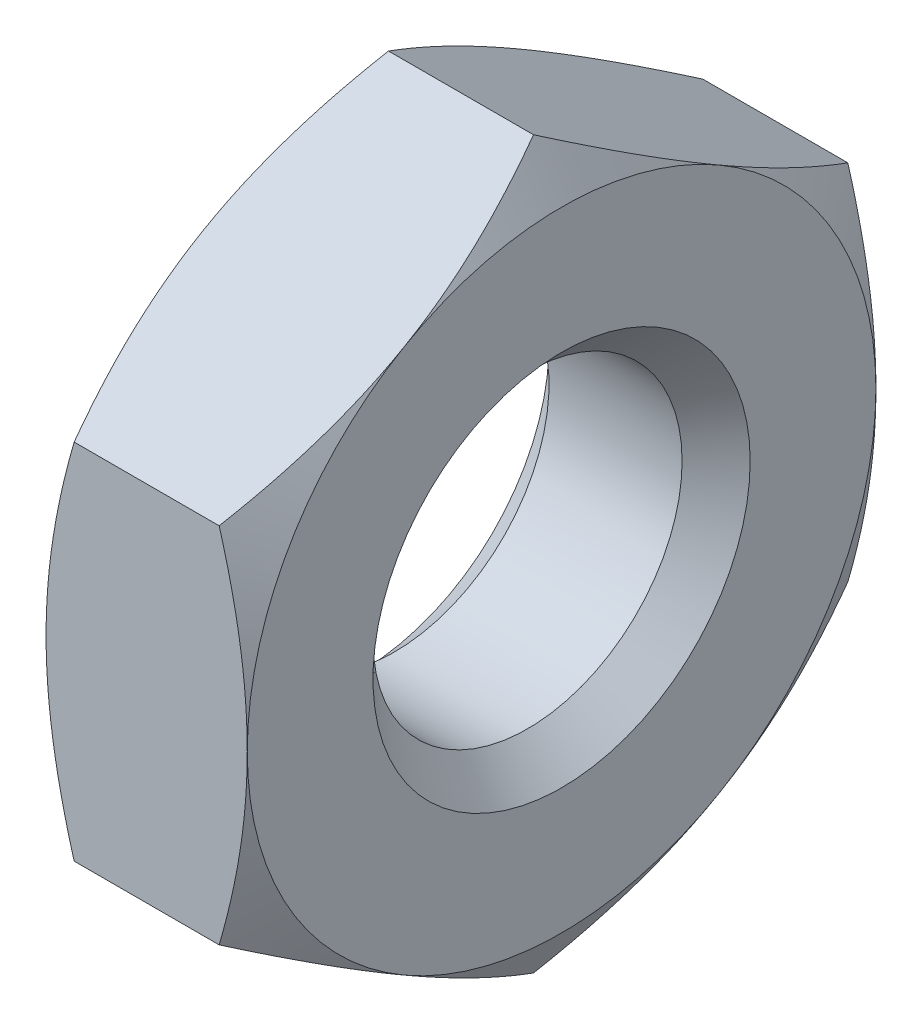
ISO-10303-21;
HEADER;
FILE_DESCRIPTION(('STEP AP214'),'2;1');
FILE_NAME('part.step','',(''),(''),'','','');
FILE_SCHEMA(('AUTOMOTIVE_DESIGN { 1 0 10303 214 1 1 1 1 }'));
ENDSEC;
DATA;
#1=APPLICATION_CONTEXT('core data for automotive mechanical design processes');
#2=APPLICATION_PROTOCOL_DEFINITION('international standard','automotive_design',2000,#1);
#3=PRODUCT_CONTEXT('',#1,'mechanical');
#4=PRODUCT('Part','Part','',(#3));
#5=PRODUCT_RELATED_PRODUCT_CATEGORY('part','',(#4));
#6=PRODUCT_DEFINITION_FORMATION('','',#4);
#7=PRODUCT_DEFINITION_CONTEXT('part definition',#1,'design');
#8=PRODUCT_DEFINITION('design','',#6,#7);
#9=PRODUCT_DEFINITION_SHAPE('','',#8);
#10=(LENGTH_UNIT() NAMED_UNIT(*) SI_UNIT(.MILLI.,.METRE.));
#11=(NAMED_UNIT(*) PLANE_ANGLE_UNIT() SI_UNIT($,.RADIAN.));
#12=(NAMED_UNIT(*) SI_UNIT($,.STERADIAN.) SOLID_ANGLE_UNIT());
#13=UNCERTAINTY_MEASURE_WITH_UNIT(LENGTH_MEASURE(1.E-05),#10,'distance_accuracy_value','');
#14=(GEOMETRIC_REPRESENTATION_CONTEXT(3) GLOBAL_UNCERTAINTY_ASSIGNED_CONTEXT((#13)) GLOBAL_UNIT_ASSIGNED_CONTEXT((#10,
#11,#12)) REPRESENTATION_CONTEXT('',''));
#15=CARTESIAN_POINT('',(0.,0.,0.));
#16=DIRECTION('',(0.,0.,1.));
#17=DIRECTION('',(1.,0.,0.));
#18=AXIS2_PLACEMENT_3D('',#15,#16,#17);
#19=CARTESIAN_POINT('',(0.8,0.,0.));
#20=DIRECTION('',(1.,0.,0.));
#21=DIRECTION('',(0.,1.,0.));
#22=AXIS2_PLACEMENT_3D('',#19,#20,#21);
#23=CONICAL_SURFACE('',#22,6.3856406460551,1.0471975511966);
#24=CARTESIAN_POINT('',(0.,0.,0.));
#25=DIRECTION('',(-1.,0.,0.));
#26=DIRECTION('',(0.,1.,0.));
#27=AXIS2_PLACEMENT_3D('',#24,#25,#26);
#28=CIRCLE('',#27,5.);
#29=CARTESIAN_POINT('',(0.,4.33012701892219,2.5));
#30=VERTEX_POINT('',#29);
#31=CARTESIAN_POINT('',(0.,4.33012701892219,-2.5));
#32=VERTEX_POINT('',#31);
#33=EDGE_CURVE('E78',#30,#32,#28,.T.);
#34=ORIENTED_EDGE('',*,*,#33,.F.);
#35=CARTESIAN_POINT('',(0.,4.33012701892219,2.5));
#36=CARTESIAN_POINT('',(0.,5.,1.33974596215561));
#37=CARTESIAN_POINT('',(0.446581987385204,5.77350269189627,0.));
#38=(BOUNDED_CURVE() B_SPLINE_CURVE(2,(#35,#36,#37),.UNSPECIFIED.,.F.,
.F.) B_SPLINE_CURVE_WITH_KNOTS((3,3),(6.19461982433195,9.57124207989386),
.UNSPECIFIED.) CURVE() GEOMETRIC_REPRESENTATION_ITEM() RATIONAL_B_SPLINE_CURVE((1.,
1.07091665572659,1.06452146187822)) REPRESENTATION_ITEM(''));
#39=CARTESIAN_POINT('',(0.446581987385204,5.77350269189626,0.));
#40=VERTEX_POINT('',#39);
#41=EDGE_CURVE('E303',#30,#40,#38,.T.);
#42=ORIENTED_EDGE('',*,*,#41,.T.);
#43=CARTESIAN_POINT('',(0.446581987385204,5.77350269189627,0.));
#44=CARTESIAN_POINT('',(0.,5.,-1.33974596215561));
#45=CARTESIAN_POINT('',(0.,4.33012701892219,-2.5));
#46=(BOUNDED_CURVE() B_SPLINE_CURVE(2,(#43,#44,#45),.UNSPECIFIED.,.F.,
.F.) B_SPLINE_CURVE_WITH_KNOTS((3,3),(2.81799756877004,6.19461982433195),
.UNSPECIFIED.) CURVE() GEOMETRIC_REPRESENTATION_ITEM() RATIONAL_B_SPLINE_CURVE((1.06452146187822,
1.07091665572659,1.)) REPRESENTATION_ITEM(''));
#47=EDGE_CURVE('E311',#40,#32,#46,.T.);
#48=ORIENTED_EDGE('',*,*,#47,.T.);
#49=EDGE_LOOP('',(#34,#42,#48));
#50=FACE_BOUND('',#49,.T.);
#51=ADVANCED_FACE('F60',(#50),#23,.T.);
#52=CARTESIAN_POINT('',(0.8,0.,0.));
#53=DIRECTION('',(1.,0.,0.));
#54=DIRECTION('',(0.,1.,0.));
#55=AXIS2_PLACEMENT_3D('',#52,#53,#54);
#56=CONICAL_SURFACE('',#55,6.3856406460551,1.0471975511966);
#57=CARTESIAN_POINT('',(0.,-4.33012701892219,-2.5));
#58=CARTESIAN_POINT('',(0.,-5.,-1.33974596215561));
#59=CARTESIAN_POINT('',(0.446581987385204,-5.77350269189627,0.));
#60=(BOUNDED_CURVE() B_SPLINE_CURVE(2,(#57,#58,#59),.UNSPECIFIED.,.F.,
.F.) B_SPLINE_CURVE_WITH_KNOTS((3,3),(6.19461982433195,9.57124207989386),
.UNSPECIFIED.) CURVE() GEOMETRIC_REPRESENTATION_ITEM() RATIONAL_B_SPLINE_CURVE((1.,
1.07091665572659,1.06452146187822)) REPRESENTATION_ITEM(''));
#61=CARTESIAN_POINT('',(0.,-4.33012701892219,-2.5));
#62=VERTEX_POINT('',#61);
#63=CARTESIAN_POINT('',(0.446581987385204,-5.77350269189626,0.));
#64=VERTEX_POINT('',#63);
#65=EDGE_CURVE('E262',#62,#64,#60,.T.);
#66=ORIENTED_EDGE('',*,*,#65,.T.);
#67=CARTESIAN_POINT('',(0.446581987385204,-5.77350269189627,0.));
#68=CARTESIAN_POINT('',(0.,-5.,1.33974596215561));
#69=CARTESIAN_POINT('',(0.,-4.33012701892219,2.5));
#70=(BOUNDED_CURVE() B_SPLINE_CURVE(2,(#67,#68,#69),.UNSPECIFIED.,.F.,
.F.) B_SPLINE_CURVE_WITH_KNOTS((3,3),(2.81799756877004,6.19461982433195),
.UNSPECIFIED.) CURVE() GEOMETRIC_REPRESENTATION_ITEM() RATIONAL_B_SPLINE_CURVE((1.06452146187822,
1.07091665572659,1.)) REPRESENTATION_ITEM(''));
#71=CARTESIAN_POINT('',(0.,-4.33012701892219,2.5));
#72=VERTEX_POINT('',#71);
#73=EDGE_CURVE('E149',#64,#72,#70,.T.);
#74=ORIENTED_EDGE('',*,*,#73,.T.);
#75=CARTESIAN_POINT('',(0.,0.,0.));
#76=DIRECTION('',(-1.,0.,0.));
#77=DIRECTION('',(0.,1.,0.));
#78=AXIS2_PLACEMENT_3D('',#75,#76,#77);
#79=CIRCLE('',#78,5.);
#80=EDGE_CURVE('E443',#62,#72,#79,.T.);
#81=ORIENTED_EDGE('',*,*,#80,.F.);
#82=EDGE_LOOP('',(#66,#74,#81));
#83=FACE_BOUND('',#82,.T.);
#84=ADVANCED_FACE('F482',(#83),#56,.T.);
#85=CARTESIAN_POINT('',(2.4,0.,0.));
#86=DIRECTION('',(-1.,0.,0.));
#87=DIRECTION('',(0.,1.,0.));
#88=AXIS2_PLACEMENT_3D('',#85,#86,#87);
#89=CONICAL_SURFACE('',#88,6.38564064605511,1.0471975511966);
#90=CARTESIAN_POINT('',(3.2,4.33012701892219,-2.5));
#91=CARTESIAN_POINT('',(3.2,5.,-1.33974596215561));
#92=CARTESIAN_POINT('',(2.7534180126148,5.77350269189627,0.));
#93=(BOUNDED_CURVE() B_SPLINE_CURVE(2,(#90,#91,#92),.UNSPECIFIED.,.F.,
.F.) B_SPLINE_CURVE_WITH_KNOTS((3,3),(6.19461982433194,9.57124207989385),
.UNSPECIFIED.) CURVE() GEOMETRIC_REPRESENTATION_ITEM() RATIONAL_B_SPLINE_CURVE((1.,
1.0709166557266,1.06452146187822)) REPRESENTATION_ITEM(''));
#94=CARTESIAN_POINT('',(3.2,4.33012701892219,-2.5));
#95=VERTEX_POINT('',#94);
#96=CARTESIAN_POINT('',(2.7534180126148,5.77350269189626,0.));
#97=VERTEX_POINT('',#96);
#98=EDGE_CURVE('E371',#95,#97,#93,.T.);
#99=ORIENTED_EDGE('',*,*,#98,.T.);
#100=CARTESIAN_POINT('',(2.7534180126148,5.77350269189627,0.));
#101=CARTESIAN_POINT('',(3.2,5.,1.33974596215561));
#102=CARTESIAN_POINT('',(3.2,4.33012701892219,2.5));
#103=(BOUNDED_CURVE() B_SPLINE_CURVE(2,(#100,#101,#102),.UNSPECIFIED.,.F.,
.F.) B_SPLINE_CURVE_WITH_KNOTS((3,3),(2.81799756877003,6.19461982433194),
.UNSPECIFIED.) CURVE() GEOMETRIC_REPRESENTATION_ITEM() RATIONAL_B_SPLINE_CURVE((1.06452146187822,
1.0709166557266,1.)) REPRESENTATION_ITEM(''));
#104=CARTESIAN_POINT('',(3.2,4.33012701892219,2.5));
#105=VERTEX_POINT('',#104);
#106=EDGE_CURVE('E102',#97,#105,#103,.T.);
#107=ORIENTED_EDGE('',*,*,#106,.T.);
#108=CARTESIAN_POINT('',(3.2,0.,0.));
#109=DIRECTION('',(-1.,0.,0.));
#110=DIRECTION('',(0.,1.,0.));
#111=AXIS2_PLACEMENT_3D('',#108,#109,#110);
#112=CIRCLE('',#111,5.);
#113=EDGE_CURVE('E238',#105,#95,#112,.T.);
#114=ORIENTED_EDGE('',*,*,#113,.T.);
#115=EDGE_LOOP('',(#99,#107,#114));
#116=FACE_BOUND('',#115,.T.);
#117=ADVANCED_FACE('F586',(#116),#89,.T.);
#118=CARTESIAN_POINT('',(2.4,0.,0.));
#119=DIRECTION('',(-1.,0.,0.));
#120=DIRECTION('',(0.,1.,0.));
#121=AXIS2_PLACEMENT_3D('',#118,#119,#120);
#122=CONICAL_SURFACE('',#121,6.38564064605511,1.0471975511966);
#123=CARTESIAN_POINT('',(3.2,0.,0.));
#124=DIRECTION('',(-1.,0.,0.));
#125=DIRECTION('',(0.,1.,0.));
#126=AXIS2_PLACEMENT_3D('',#123,#124,#125);
#127=CIRCLE('',#126,5.);
#128=CARTESIAN_POINT('',(3.2,-4.33012701892219,-2.5));
#129=VERTEX_POINT('',#128);
#130=CARTESIAN_POINT('',(3.2,-4.33012701892219,2.5));
#131=VERTEX_POINT('',#130);
#132=EDGE_CURVE('E180',#129,#131,#127,.T.);
#133=ORIENTED_EDGE('',*,*,#132,.T.);
#134=CARTESIAN_POINT('',(3.2,-4.33012701892219,2.5));
#135=CARTESIAN_POINT('',(3.2,-5.,1.33974596215561));
#136=CARTESIAN_POINT('',(2.7534180126148,-5.77350269189627,0.));
#137=(BOUNDED_CURVE() B_SPLINE_CURVE(2,(#134,#135,#136),.UNSPECIFIED.,.F.,
.F.) B_SPLINE_CURVE_WITH_KNOTS((3,3),(6.19461982433194,9.57124207989385),
.UNSPECIFIED.) CURVE() GEOMETRIC_REPRESENTATION_ITEM() RATIONAL_B_SPLINE_CURVE((1.,
1.0709166557266,1.06452146187822)) REPRESENTATION_ITEM(''));
#138=CARTESIAN_POINT('',(2.7534180126148,-5.77350269189626,0.));
#139=VERTEX_POINT('',#138);
#140=EDGE_CURVE('E239',#131,#139,#137,.T.);
#141=ORIENTED_EDGE('',*,*,#140,.T.);
#142=CARTESIAN_POINT('',(2.7534180126148,-5.77350269189627,0.));
#143=CARTESIAN_POINT('',(3.2,-5.,-1.33974596215561));
#144=CARTESIAN_POINT('',(3.2,-4.33012701892219,-2.5));
#145=(BOUNDED_CURVE() B_SPLINE_CURVE(2,(#142,#143,#144),.UNSPECIFIED.,.F.,
.F.) B_SPLINE_CURVE_WITH_KNOTS((3,3),(2.81799756877003,6.19461982433194),
.UNSPECIFIED.) CURVE() GEOMETRIC_REPRESENTATION_ITEM() RATIONAL_B_SPLINE_CURVE((1.06452146187822,
1.0709166557266,1.)) REPRESENTATION_ITEM(''));
#146=EDGE_CURVE('E325',#139,#129,#145,.T.);
#147=ORIENTED_EDGE('',*,*,#146,.T.);
#148=EDGE_LOOP('',(#133,#141,#147));
#149=FACE_BOUND('',#148,.T.);
#150=ADVANCED_FACE('F582',(#149),#122,.T.);
#151=CARTESIAN_POINT('',(0.,-2.88675134594813,-5.));
#152=DIRECTION('',(0.,0.,1.));
#153=DIRECTION('',(1.,0.,0.));
#154=AXIS2_PLACEMENT_3D('',#151,#152,#153);
#155=PLANE('',#154);
#156=CARTESIAN_POINT('',(2.7534180126148,-2.88675134594813,-5.));
#157=CARTESIAN_POINT('',(3.2,-1.33974596215562,-5.));
#158=CARTESIAN_POINT('',(3.2,0.,-5.));
#159=(BOUNDED_CURVE() B_SPLINE_CURVE(2,(#156,#157,#158),.UNSPECIFIED.,.F.,
.F.) B_SPLINE_CURVE_WITH_KNOTS((3,3),(2.81799756877004,6.19461982433194),
.UNSPECIFIED.) CURVE() GEOMETRIC_REPRESENTATION_ITEM() RATIONAL_B_SPLINE_CURVE((1.06452146187822,
1.0709166557266,1.)) REPRESENTATION_ITEM(''));
#160=CARTESIAN_POINT('',(2.7534180126148,-2.88675134594813,-5.));
#161=VERTEX_POINT('',#160);
#162=CARTESIAN_POINT('',(3.2,0.,-5.));
#163=VERTEX_POINT('',#162);
#164=EDGE_CURVE('E164',#161,#163,#159,.T.);
#165=ORIENTED_EDGE('',*,*,#164,.F.);
#166=DIRECTION('',(1.,0.,0.));
#167=VECTOR('',#166,1.);
#168=CARTESIAN_POINT('',(0.,-2.88675134594813,-5.));
#169=LINE('',#168,#167);
#170=CARTESIAN_POINT('',(0.446581987385204,-2.88675134594813,-5.));
#171=VERTEX_POINT('',#170);
#172=EDGE_CURVE('E529',#171,#161,#169,.T.);
#173=ORIENTED_EDGE('',*,*,#172,.F.);
#174=CARTESIAN_POINT('',(0.,0.,-5.));
#175=CARTESIAN_POINT('',(0.,-1.33974596215561,-5.));
#176=CARTESIAN_POINT('',(0.446581987385204,-2.88675134594813,-5.));
#177=(BOUNDED_CURVE() B_SPLINE_CURVE(2,(#174,#175,#176),.UNSPECIFIED.,.F.,
.F.) B_SPLINE_CURVE_WITH_KNOTS((3,3),(6.19461982433194,9.57124207989385),
.UNSPECIFIED.) CURVE() GEOMETRIC_REPRESENTATION_ITEM() RATIONAL_B_SPLINE_CURVE((1.,
1.07091665572659,1.06452146187822)) REPRESENTATION_ITEM(''));
#178=CARTESIAN_POINT('',(0.,0.,-5.));
#179=VERTEX_POINT('',#178);
#180=EDGE_CURVE('E428',#179,#171,#177,.T.);
#181=ORIENTED_EDGE('',*,*,#180,.F.);
#182=CARTESIAN_POINT('',(0.446581987385204,2.88675134594813,-5.));
#183=CARTESIAN_POINT('',(0.,1.33974596215561,-5.));
#184=CARTESIAN_POINT('',(0.,0.,-5.));
#185=(BOUNDED_CURVE() B_SPLINE_CURVE(2,(#182,#183,#184),.UNSPECIFIED.,.F.,
.F.) B_SPLINE_CURVE_WITH_KNOTS((3,3),(2.81799756877003,6.19461982433194),
.UNSPECIFIED.) CURVE() GEOMETRIC_REPRESENTATION_ITEM() RATIONAL_B_SPLINE_CURVE((1.06452146187822,
1.07091665572659,1.)) REPRESENTATION_ITEM(''));
#186=CARTESIAN_POINT('',(0.446581987385204,2.88675134594813,-5.));
#187=VERTEX_POINT('',#186);
#188=EDGE_CURVE('E312',#187,#179,#185,.T.);
#189=ORIENTED_EDGE('',*,*,#188,.F.);
#190=DIRECTION('',(1.,0.,0.));
#191=VECTOR('',#190,1.);
#192=CARTESIAN_POINT('',(0.,2.88675134594813,-5.));
#193=LINE('',#192,#191);
#194=CARTESIAN_POINT('',(2.7534180126148,2.88675134594813,-5.));
#195=VERTEX_POINT('',#194);
#196=EDGE_CURVE('E167',#187,#195,#193,.T.);
#197=ORIENTED_EDGE('',*,*,#196,.T.);
#198=CARTESIAN_POINT('',(3.2,0.,-5.));
#199=CARTESIAN_POINT('',(3.2,1.33974596215562,-5.));
#200=CARTESIAN_POINT('',(2.7534180126148,2.88675134594813,-5.));
#201=(BOUNDED_CURVE() B_SPLINE_CURVE(2,(#198,#199,#200),.UNSPECIFIED.,.F.,
.F.) B_SPLINE_CURVE_WITH_KNOTS((3,3),(6.19461982433194,9.57124207989385),
.UNSPECIFIED.) CURVE() GEOMETRIC_REPRESENTATION_ITEM() RATIONAL_B_SPLINE_CURVE((1.,
1.0709166557266,1.06452146187822)) REPRESENTATION_ITEM(''));
#202=EDGE_CURVE('E157',#163,#195,#201,.T.);
#203=ORIENTED_EDGE('',*,*,#202,.F.);
#204=EDGE_LOOP('',(#165,#173,#181,#189,#197,#203));
#205=FACE_BOUND('',#204,.T.);
#206=ADVANCED_FACE('F161',(#205),#155,.F.);
#207=CARTESIAN_POINT('',(0.,5.77350269189626,0.));
#208=DIRECTION('',(0.,-0.866025403784439,-0.5));
#209=DIRECTION('',(0.,0.5,-0.866025403784439));
#210=AXIS2_PLACEMENT_3D('',#207,#208,#209);
#211=PLANE('',#210);
#212=ORIENTED_EDGE('',*,*,#106,.F.);
#213=DIRECTION('',(1.,0.,0.));
#214=VECTOR('',#213,1.);
#215=CARTESIAN_POINT('',(0.,5.77350269189626,0.));
#216=LINE('',#215,#214);
#217=EDGE_CURVE('E500',#40,#97,#216,.T.);
#218=ORIENTED_EDGE('',*,*,#217,.F.);
#219=ORIENTED_EDGE('',*,*,#41,.F.);
#220=CARTESIAN_POINT('',(0.446581987385204,2.88675134594813,5.));
#221=CARTESIAN_POINT('',(0.,3.66025403784439,3.66025403784439));
#222=CARTESIAN_POINT('',(0.,4.33012701892219,2.5));
#223=(BOUNDED_CURVE() B_SPLINE_CURVE(2,(#220,#221,#222),.UNSPECIFIED.,.F.,
.F.) B_SPLINE_CURVE_WITH_KNOTS((3,3),(2.81799756877004,6.19461982433195),
.UNSPECIFIED.) CURVE() GEOMETRIC_REPRESENTATION_ITEM() RATIONAL_B_SPLINE_CURVE((1.06452146187822,
1.07091665572659,1.)) REPRESENTATION_ITEM(''));
#224=CARTESIAN_POINT('',(0.446581987385204,2.88675134594813,5.));
#225=VERTEX_POINT('',#224);
#226=EDGE_CURVE('E385',#225,#30,#223,.T.);
#227=ORIENTED_EDGE('',*,*,#226,.F.);
#228=DIRECTION('',(1.,0.,0.));
#229=VECTOR('',#228,1.);
#230=CARTESIAN_POINT('',(0.,2.88675134594813,5.));
#231=LINE('',#230,#229);
#232=CARTESIAN_POINT('',(2.7534180126148,2.88675134594813,5.));
#233=VERTEX_POINT('',#232);
#234=EDGE_CURVE('E380',#225,#233,#231,.T.);
#235=ORIENTED_EDGE('',*,*,#234,.T.);
#236=CARTESIAN_POINT('',(3.2,4.33012701892219,2.5));
#237=CARTESIAN_POINT('',(3.2,3.66025403784438,3.66025403784439));
#238=CARTESIAN_POINT('',(2.7534180126148,2.88675134594813,5.));
#239=(BOUNDED_CURVE() B_SPLINE_CURVE(2,(#236,#237,#238),.UNSPECIFIED.,.F.,
.F.) B_SPLINE_CURVE_WITH_KNOTS((3,3),(6.19461982433194,9.57124207989386),
.UNSPECIFIED.) CURVE() GEOMETRIC_REPRESENTATION_ITEM() RATIONAL_B_SPLINE_CURVE((1.,
1.0709166557266,1.06452146187822)) REPRESENTATION_ITEM(''));
#240=EDGE_CURVE('E110',#105,#233,#239,.T.);
#241=ORIENTED_EDGE('',*,*,#240,.F.);
#242=EDGE_LOOP('',(#212,#218,#219,#227,#235,#241));
#243=FACE_BOUND('',#242,.T.);
#244=ADVANCED_FACE('F498',(#243),#211,.F.);
#245=CARTESIAN_POINT('',(0.,2.88675134594813,-5.));
#246=DIRECTION('',(0.,-0.866025403784439,0.5));
#247=DIRECTION('',(-1.,0.,0.));
#248=AXIS2_PLACEMENT_3D('',#245,#246,#247);
#249=PLANE('',#248);
#250=CARTESIAN_POINT('',(2.7534180126148,2.88675134594813,-5.));
#251=CARTESIAN_POINT('',(3.2,3.66025403784438,-3.66025403784439));
#252=CARTESIAN_POINT('',(3.2,4.33012701892219,-2.5));
#253=(BOUNDED_CURVE() B_SPLINE_CURVE(2,(#250,#251,#252),.UNSPECIFIED.,.F.,
.F.) B_SPLINE_CURVE_WITH_KNOTS((3,3),(2.81799756877003,6.19461982433194),
.UNSPECIFIED.) CURVE() GEOMETRIC_REPRESENTATION_ITEM() RATIONAL_B_SPLINE_CURVE((1.06452146187822,
1.0709166557266,1.)) REPRESENTATION_ITEM(''));
#254=EDGE_CURVE('E119',#195,#95,#253,.T.);
#255=ORIENTED_EDGE('',*,*,#254,.F.);
#256=ORIENTED_EDGE('',*,*,#196,.F.);
#257=CARTESIAN_POINT('',(0.,4.33012701892219,-2.5));
#258=CARTESIAN_POINT('',(0.,3.66025403784439,-3.66025403784439));
#259=CARTESIAN_POINT('',(0.446581987385204,2.88675134594813,-5.));
#260=(BOUNDED_CURVE() B_SPLINE_CURVE(2,(#257,#258,#259),.UNSPECIFIED.,.F.,
.F.) B_SPLINE_CURVE_WITH_KNOTS((3,3),(6.19461982433195,9.57124207989386),
.UNSPECIFIED.) CURVE() GEOMETRIC_REPRESENTATION_ITEM() RATIONAL_B_SPLINE_CURVE((1.,
1.07091665572659,1.06452146187822)) REPRESENTATION_ITEM(''));
#261=EDGE_CURVE('E472',#32,#187,#260,.T.);
#262=ORIENTED_EDGE('',*,*,#261,.F.);
#263=ORIENTED_EDGE('',*,*,#47,.F.);
#264=ORIENTED_EDGE('',*,*,#217,.T.);
#265=ORIENTED_EDGE('',*,*,#98,.F.);
#266=EDGE_LOOP('',(#255,#256,#262,#263,#264,#265));
#267=FACE_BOUND('',#266,.T.);
#268=ADVANCED_FACE('F587',(#267),#249,.F.);
#269=CARTESIAN_POINT('',(0.,2.88675134594813,5.));
#270=DIRECTION('',(0.,0.,-1.));
#271=DIRECTION('',(0.,-1.,0.));
#272=AXIS2_PLACEMENT_3D('',#269,#270,#271);
#273=PLANE('',#272);
#274=CARTESIAN_POINT('',(3.2,0.,5.));
#275=CARTESIAN_POINT('',(3.2,-1.33974596215562,5.));
#276=CARTESIAN_POINT('',(2.7534180126148,-2.88675134594813,5.));
#277=(BOUNDED_CURVE() B_SPLINE_CURVE(2,(#274,#275,#276),.UNSPECIFIED.,.F.,
.F.) B_SPLINE_CURVE_WITH_KNOTS((3,3),(6.19461982433194,9.57124207989385),
.UNSPECIFIED.) CURVE() GEOMETRIC_REPRESENTATION_ITEM() RATIONAL_B_SPLINE_CURVE((1.,
1.0709166557266,1.06452146187822)) REPRESENTATION_ITEM(''));
#278=CARTESIAN_POINT('',(3.2,0.,5.));
#279=VERTEX_POINT('',#278);
#280=CARTESIAN_POINT('',(2.7534180126148,-2.88675134594813,5.));
#281=VERTEX_POINT('',#280);
#282=EDGE_CURVE('E188',#279,#281,#277,.T.);
#283=ORIENTED_EDGE('',*,*,#282,.F.);
#284=CARTESIAN_POINT('',(2.7534180126148,2.88675134594813,5.));
#285=CARTESIAN_POINT('',(3.2,1.33974596215562,5.));
#286=CARTESIAN_POINT('',(3.2,0.,5.));
#287=(BOUNDED_CURVE() B_SPLINE_CURVE(2,(#284,#285,#286),.UNSPECIFIED.,.F.,
.F.) B_SPLINE_CURVE_WITH_KNOTS((3,3),(2.81799756877004,6.19461982433194),
.UNSPECIFIED.) CURVE() GEOMETRIC_REPRESENTATION_ITEM() RATIONAL_B_SPLINE_CURVE((1.06452146187822,
1.0709166557266,1.)) REPRESENTATION_ITEM(''));
#288=EDGE_CURVE('E197',#233,#279,#287,.T.);
#289=ORIENTED_EDGE('',*,*,#288,.F.);
#290=ORIENTED_EDGE('',*,*,#234,.F.);
#291=CARTESIAN_POINT('',(0.,0.,5.));
#292=CARTESIAN_POINT('',(0.,1.33974596215561,5.));
#293=CARTESIAN_POINT('',(0.446581987385204,2.88675134594813,5.));
#294=(BOUNDED_CURVE() B_SPLINE_CURVE(2,(#291,#292,#293),.UNSPECIFIED.,.F.,
.F.) B_SPLINE_CURVE_WITH_KNOTS((3,3),(6.19461982433194,9.57124207989385),
.UNSPECIFIED.) CURVE() GEOMETRIC_REPRESENTATION_ITEM() RATIONAL_B_SPLINE_CURVE((1.,
1.07091665572659,1.06452146187822)) REPRESENTATION_ITEM(''));
#295=CARTESIAN_POINT('',(0.,0.,5.));
#296=VERTEX_POINT('',#295);
#297=EDGE_CURVE('E224',#296,#225,#294,.T.);
#298=ORIENTED_EDGE('',*,*,#297,.F.);
#299=CARTESIAN_POINT('',(0.446581987385204,-2.88675134594813,5.));
#300=CARTESIAN_POINT('',(0.,-1.33974596215561,5.));
#301=CARTESIAN_POINT('',(0.,0.,5.));
#302=(BOUNDED_CURVE() B_SPLINE_CURVE(2,(#299,#300,#301),.UNSPECIFIED.,.F.,
.F.) B_SPLINE_CURVE_WITH_KNOTS((3,3),(2.81799756877003,6.19461982433194),
.UNSPECIFIED.) CURVE() GEOMETRIC_REPRESENTATION_ITEM() RATIONAL_B_SPLINE_CURVE((1.06452146187822,
1.07091665572659,1.)) REPRESENTATION_ITEM(''));
#303=CARTESIAN_POINT('',(0.446581987385204,-2.88675134594813,5.));
#304=VERTEX_POINT('',#303);
#305=EDGE_CURVE('E429',#304,#296,#302,.T.);
#306=ORIENTED_EDGE('',*,*,#305,.F.);
#307=DIRECTION('',(1.,0.,0.));
#308=VECTOR('',#307,1.);
#309=CARTESIAN_POINT('',(0.,-2.88675134594813,5.));
#310=LINE('',#309,#308);
#311=EDGE_CURVE('E240',#304,#281,#310,.T.);
#312=ORIENTED_EDGE('',*,*,#311,.T.);
#313=EDGE_LOOP('',(#283,#289,#290,#298,#306,#312));
#314=FACE_BOUND('',#313,.T.);
#315=ADVANCED_FACE('F543',(#314),#273,.F.);
#316=CARTESIAN_POINT('',(0.,-2.88675134594813,5.));
#317=DIRECTION('',(0.,0.866025403784439,-0.5));
#318=DIRECTION('',(-1.,0.,0.));
#319=AXIS2_PLACEMENT_3D('',#316,#317,#318);
#320=PLANE('',#319);
#321=ORIENTED_EDGE('',*,*,#140,.F.);
#322=CARTESIAN_POINT('',(2.7534180126148,-2.88675134594813,5.));
#323=CARTESIAN_POINT('',(3.2,-3.66025403784438,3.66025403784439));
#324=CARTESIAN_POINT('',(3.2,-4.33012701892219,2.5));
#325=(BOUNDED_CURVE() B_SPLINE_CURVE(2,(#322,#323,#324),.UNSPECIFIED.,.F.,
.F.) B_SPLINE_CURVE_WITH_KNOTS((3,3),(2.81799756877003,6.19461982433194),
.UNSPECIFIED.) CURVE() GEOMETRIC_REPRESENTATION_ITEM() RATIONAL_B_SPLINE_CURVE((1.06452146187822,
1.0709166557266,1.)) REPRESENTATION_ITEM(''));
#326=EDGE_CURVE('E204',#281,#131,#325,.T.);
#327=ORIENTED_EDGE('',*,*,#326,.F.);
#328=ORIENTED_EDGE('',*,*,#311,.F.);
#329=CARTESIAN_POINT('',(0.,-4.33012701892219,2.5));
#330=CARTESIAN_POINT('',(0.,-3.66025403784439,3.66025403784439));
#331=CARTESIAN_POINT('',(0.446581987385204,-2.88675134594813,5.));
#332=(BOUNDED_CURVE() B_SPLINE_CURVE(2,(#329,#330,#331),.UNSPECIFIED.,.F.,
.F.) B_SPLINE_CURVE_WITH_KNOTS((3,3),(6.19461982433195,9.57124207989386),
.UNSPECIFIED.) CURVE() GEOMETRIC_REPRESENTATION_ITEM() RATIONAL_B_SPLINE_CURVE((1.,
1.07091665572659,1.06452146187822)) REPRESENTATION_ITEM(''));
#333=EDGE_CURVE('E422',#72,#304,#332,.T.);
#334=ORIENTED_EDGE('',*,*,#333,.F.);
#335=ORIENTED_EDGE('',*,*,#73,.F.);
#336=DIRECTION('',(1.,0.,0.));
#337=VECTOR('',#336,1.);
#338=CARTESIAN_POINT('',(0.,-5.77350269189626,0.));
#339=LINE('',#338,#337);
#340=EDGE_CURVE('E202',#64,#139,#339,.T.);
#341=ORIENTED_EDGE('',*,*,#340,.T.);
#342=EDGE_LOOP('',(#321,#327,#328,#334,#335,#341));
#343=FACE_BOUND('',#342,.T.);
#344=ADVANCED_FACE('F564',(#343),#320,.F.);
#345=CARTESIAN_POINT('',(0.,-5.77350269189626,0.));
#346=DIRECTION('',(0.,0.866025403784439,0.5));
#347=DIRECTION('',(1.,0.,0.));
#348=AXIS2_PLACEMENT_3D('',#345,#346,#347);
#349=PLANE('',#348);
#350=CARTESIAN_POINT('',(3.2,-4.33012701892219,-2.5));
#351=CARTESIAN_POINT('',(3.2,-3.66025403784438,-3.66025403784439));
#352=CARTESIAN_POINT('',(2.7534180126148,-2.88675134594813,-5.));
#353=(BOUNDED_CURVE() B_SPLINE_CURVE(2,(#350,#351,#352),.UNSPECIFIED.,.F.,
.F.) B_SPLINE_CURVE_WITH_KNOTS((3,3),(6.19461982433194,9.57124207989386),
.UNSPECIFIED.) CURVE() GEOMETRIC_REPRESENTATION_ITEM() RATIONAL_B_SPLINE_CURVE((1.,
1.0709166557266,1.06452146187822)) REPRESENTATION_ITEM(''));
#354=EDGE_CURVE('E169',#129,#161,#353,.T.);
#355=ORIENTED_EDGE('',*,*,#354,.F.);
#356=ORIENTED_EDGE('',*,*,#146,.F.);
#357=ORIENTED_EDGE('',*,*,#340,.F.);
#358=ORIENTED_EDGE('',*,*,#65,.F.);
#359=CARTESIAN_POINT('',(0.446581987385204,-2.88675134594813,-5.));
#360=CARTESIAN_POINT('',(0.,-3.66025403784439,-3.66025403784439));
#361=CARTESIAN_POINT('',(0.,-4.33012701892219,-2.5));
#362=(BOUNDED_CURVE() B_SPLINE_CURVE(2,(#359,#360,#361),.UNSPECIFIED.,.F.,
.F.) B_SPLINE_CURVE_WITH_KNOTS((3,3),(2.81799756877004,6.19461982433195),
.UNSPECIFIED.) CURVE() GEOMETRIC_REPRESENTATION_ITEM() RATIONAL_B_SPLINE_CURVE((1.06452146187822,
1.07091665572659,1.)) REPRESENTATION_ITEM(''));
#363=EDGE_CURVE('E242',#171,#62,#362,.T.);
#364=ORIENTED_EDGE('',*,*,#363,.F.);
#365=ORIENTED_EDGE('',*,*,#172,.T.);
#366=EDGE_LOOP('',(#355,#356,#357,#358,#364,#365));
#367=FACE_BOUND('',#366,.T.);
#368=ADVANCED_FACE('F474',(#367),#349,.F.);
#369=CARTESIAN_POINT('',(2.4,0.,0.));
#370=DIRECTION('',(-1.,0.,0.));
#371=DIRECTION('',(0.,1.,0.));
#372=AXIS2_PLACEMENT_3D('',#369,#370,#371);
#373=CONICAL_SURFACE('',#372,6.38564064605511,1.0471975511966);
#374=ORIENTED_EDGE('',*,*,#326,.T.);
#375=CARTESIAN_POINT('',(3.2,0.,0.));
#376=DIRECTION('',(-1.,0.,0.));
#377=DIRECTION('',(0.,1.,0.));
#378=AXIS2_PLACEMENT_3D('',#375,#376,#377);
#379=CIRCLE('',#378,5.);
#380=EDGE_CURVE('E289',#131,#279,#379,.T.);
#381=ORIENTED_EDGE('',*,*,#380,.T.);
#382=ORIENTED_EDGE('',*,*,#282,.T.);
#383=EDGE_LOOP('',(#374,#381,#382));
#384=FACE_BOUND('',#383,.T.);
#385=ADVANCED_FACE('F559',(#384),#373,.T.);
#386=CARTESIAN_POINT('',(2.4,0.,0.));
#387=DIRECTION('',(-1.,0.,0.));
#388=DIRECTION('',(0.,1.,0.));
#389=AXIS2_PLACEMENT_3D('',#386,#387,#388);
#390=CONICAL_SURFACE('',#389,6.38564064605511,1.0471975511966);
#391=ORIENTED_EDGE('',*,*,#164,.T.);
#392=CARTESIAN_POINT('',(3.2,0.,0.));
#393=DIRECTION('',(-1.,0.,0.));
#394=DIRECTION('',(0.,1.,0.));
#395=AXIS2_PLACEMENT_3D('',#392,#393,#394);
#396=CIRCLE('',#395,5.);
#397=EDGE_CURVE('E175',#163,#129,#396,.T.);
#398=ORIENTED_EDGE('',*,*,#397,.T.);
#399=ORIENTED_EDGE('',*,*,#354,.T.);
#400=EDGE_LOOP('',(#391,#398,#399));
#401=FACE_BOUND('',#400,.T.);
#402=ADVANCED_FACE('F185',(#401),#390,.T.);
#403=CARTESIAN_POINT('',(2.4,0.,0.));
#404=DIRECTION('',(-1.,0.,0.));
#405=DIRECTION('',(0.,1.,0.));
#406=AXIS2_PLACEMENT_3D('',#403,#404,#405);
#407=CONICAL_SURFACE('',#406,6.38564064605511,1.0471975511966);
#408=ORIENTED_EDGE('',*,*,#202,.T.);
#409=ORIENTED_EDGE('',*,*,#254,.T.);
#410=CARTESIAN_POINT('',(3.2,0.,0.));
#411=DIRECTION('',(-1.,0.,0.));
#412=DIRECTION('',(0.,1.,0.));
#413=AXIS2_PLACEMENT_3D('',#410,#411,#412);
#414=CIRCLE('',#413,5.);
#415=EDGE_CURVE('E177',#95,#163,#414,.T.);
#416=ORIENTED_EDGE('',*,*,#415,.T.);
#417=EDGE_LOOP('',(#408,#409,#416));
#418=FACE_BOUND('',#417,.T.);
#419=ADVANCED_FACE('F190',(#418),#407,.T.);
#420=CARTESIAN_POINT('',(2.4,0.,0.));
#421=DIRECTION('',(-1.,0.,0.));
#422=DIRECTION('',(0.,1.,0.));
#423=AXIS2_PLACEMENT_3D('',#420,#421,#422);
#424=CONICAL_SURFACE('',#423,6.38564064605511,1.0471975511966);
#425=ORIENTED_EDGE('',*,*,#240,.T.);
#426=ORIENTED_EDGE('',*,*,#288,.T.);
#427=CARTESIAN_POINT('',(3.2,0.,0.));
#428=DIRECTION('',(-1.,0.,0.));
#429=DIRECTION('',(0.,1.,0.));
#430=AXIS2_PLACEMENT_3D('',#427,#428,#429);
#431=CIRCLE('',#430,5.);
#432=EDGE_CURVE('E507',#279,#105,#431,.T.);
#433=ORIENTED_EDGE('',*,*,#432,.T.);
#434=EDGE_LOOP('',(#425,#426,#433));
#435=FACE_BOUND('',#434,.T.);
#436=ADVANCED_FACE('F552',(#435),#424,.T.);
#437=CARTESIAN_POINT('',(0.8,0.,0.));
#438=DIRECTION('',(1.,0.,0.));
#439=DIRECTION('',(0.,1.,0.));
#440=AXIS2_PLACEMENT_3D('',#437,#438,#439);
#441=CONICAL_SURFACE('',#440,6.3856406460551,1.0471975511966);
#442=ORIENTED_EDGE('',*,*,#188,.T.);
#443=CARTESIAN_POINT('',(0.,0.,0.));
#444=DIRECTION('',(-1.,0.,0.));
#445=DIRECTION('',(0.,1.,0.));
#446=AXIS2_PLACEMENT_3D('',#443,#444,#445);
#447=CIRCLE('',#446,5.);
#448=EDGE_CURVE('E281',#32,#179,#447,.T.);
#449=ORIENTED_EDGE('',*,*,#448,.F.);
#450=ORIENTED_EDGE('',*,*,#261,.T.);
#451=EDGE_LOOP('',(#442,#449,#450));
#452=FACE_BOUND('',#451,.T.);
#453=ADVANCED_FACE('F505',(#452),#441,.T.);
#454=CARTESIAN_POINT('',(0.8,0.,0.));
#455=DIRECTION('',(1.,0.,0.));
#456=DIRECTION('',(0.,1.,0.));
#457=AXIS2_PLACEMENT_3D('',#454,#455,#456);
#458=CONICAL_SURFACE('',#457,6.3856406460551,1.0471975511966);
#459=ORIENTED_EDGE('',*,*,#363,.T.);
#460=CARTESIAN_POINT('',(0.,0.,0.));
#461=DIRECTION('',(-1.,0.,0.));
#462=DIRECTION('',(0.,1.,0.));
#463=AXIS2_PLACEMENT_3D('',#460,#461,#462);
#464=CIRCLE('',#463,5.);
#465=EDGE_CURVE('E288',#179,#62,#464,.T.);
#466=ORIENTED_EDGE('',*,*,#465,.F.);
#467=ORIENTED_EDGE('',*,*,#180,.T.);
#468=EDGE_LOOP('',(#459,#466,#467));
#469=FACE_BOUND('',#468,.T.);
#470=ADVANCED_FACE('F467',(#469),#458,.T.);
#471=CARTESIAN_POINT('',(0.8,0.,0.));
#472=DIRECTION('',(1.,0.,0.));
#473=DIRECTION('',(0.,1.,0.));
#474=AXIS2_PLACEMENT_3D('',#471,#472,#473);
#475=CONICAL_SURFACE('',#474,6.3856406460551,1.0471975511966);
#476=ORIENTED_EDGE('',*,*,#333,.T.);
#477=ORIENTED_EDGE('',*,*,#305,.T.);
#478=CARTESIAN_POINT('',(0.,0.,0.));
#479=DIRECTION('',(-1.,0.,0.));
#480=DIRECTION('',(0.,1.,0.));
#481=AXIS2_PLACEMENT_3D('',#478,#479,#480);
#482=CIRCLE('',#481,5.);
#483=EDGE_CURVE('E348',#72,#296,#482,.T.);
#484=ORIENTED_EDGE('',*,*,#483,.F.);
#485=EDGE_LOOP('',(#476,#477,#484));
#486=FACE_BOUND('',#485,.T.);
#487=ADVANCED_FACE('F485',(#486),#475,.T.);
#488=CARTESIAN_POINT('',(0.8,0.,0.));
#489=DIRECTION('',(1.,0.,0.));
#490=DIRECTION('',(0.,1.,0.));
#491=AXIS2_PLACEMENT_3D('',#488,#489,#490);
#492=CONICAL_SURFACE('',#491,6.3856406460551,1.0471975511966);
#493=ORIENTED_EDGE('',*,*,#297,.T.);
#494=ORIENTED_EDGE('',*,*,#226,.T.);
#495=CARTESIAN_POINT('',(0.,0.,0.));
#496=DIRECTION('',(-1.,0.,0.));
#497=DIRECTION('',(0.,1.,0.));
#498=AXIS2_PLACEMENT_3D('',#495,#496,#497);
#499=CIRCLE('',#498,5.);
#500=EDGE_CURVE('E260',#296,#30,#499,.T.);
#501=ORIENTED_EDGE('',*,*,#500,.F.);
#502=EDGE_LOOP('',(#493,#494,#501));
#503=FACE_BOUND('',#502,.T.);
#504=ADVANCED_FACE('F495',(#503),#492,.T.);
#505=CARTESIAN_POINT('',(3.2,2.5,0.));
#506=DIRECTION('',(1.,0.,0.));
#507=DIRECTION('',(0.,1.,0.));
#508=AXIS2_PLACEMENT_3D('',#505,#506,#507);
#509=PLANE('',#508);
#510=CARTESIAN_POINT('',(3.2,0.,0.));
#511=DIRECTION('',(1.,0.,0.));
#512=DIRECTION('',(0.,0.,-1.));
#513=AXIS2_PLACEMENT_3D('',#510,#511,#512);
#514=CIRCLE('',#513,3.00000000000002);
#515=CARTESIAN_POINT('',(3.2,0.,-3.00000000000002));
#516=VERTEX_POINT('',#515);
#517=EDGE_CURVE('E310',#516,#516,#514,.F.);
#518=ORIENTED_EDGE('',*,*,#517,.T.);
#519=EDGE_LOOP('',(#518));
#520=FACE_BOUND('',#519,.T.);
#521=ORIENTED_EDGE('',*,*,#113,.F.);
#522=ORIENTED_EDGE('',*,*,#432,.F.);
#523=ORIENTED_EDGE('',*,*,#380,.F.);
#524=ORIENTED_EDGE('',*,*,#132,.F.);
#525=ORIENTED_EDGE('',*,*,#397,.F.);
#526=ORIENTED_EDGE('',*,*,#415,.F.);
#527=EDGE_LOOP('',(#521,#522,#523,#524,#525,#526));
#528=FACE_BOUND('',#527,.T.);
#529=ADVANCED_FACE('F176',(#520,#528),#509,.T.);
#530=CARTESIAN_POINT('',(0.,2.5,0.));
#531=DIRECTION('',(-1.,0.,0.));
#532=DIRECTION('',(0.,0.,1.));
#533=AXIS2_PLACEMENT_3D('',#530,#531,#532);
#534=PLANE('',#533);
#535=CARTESIAN_POINT('',(0.,0.,0.));
#536=DIRECTION('',(-1.,0.,0.));
#537=DIRECTION('',(0.,0.,1.));
#538=AXIS2_PLACEMENT_3D('',#535,#536,#537);
#539=CIRCLE('',#538,3.00000000000001);
#540=CARTESIAN_POINT('',(0.,0.,3.00000000000001));
#541=VERTEX_POINT('',#540);
#542=EDGE_CURVE('E12',#541,#541,#539,.F.);
#543=ORIENTED_EDGE('',*,*,#542,.T.);
#544=EDGE_LOOP('',(#543));
#545=FACE_BOUND('',#544,.T.);
#546=ORIENTED_EDGE('',*,*,#33,.T.);
#547=ORIENTED_EDGE('',*,*,#448,.T.);
#548=ORIENTED_EDGE('',*,*,#465,.T.);
#549=ORIENTED_EDGE('',*,*,#80,.T.);
#550=ORIENTED_EDGE('',*,*,#483,.T.);
#551=ORIENTED_EDGE('',*,*,#500,.T.);
#552=EDGE_LOOP('',(#546,#547,#548,#549,#550,#551));
#553=FACE_BOUND('',#552,.T.);
#554=ADVANCED_FACE('F461',(#545,#553),#534,.T.);
#555=CARTESIAN_POINT('',(0.,0.,0.));
#556=DIRECTION('',(-1.,0.,0.));
#557=DIRECTION('',(0.,0.,1.));
#558=AXIS2_PLACEMENT_3D('',#555,#556,#557);
#559=CYLINDRICAL_SURFACE('',#558,2.45850000000001);
#560=CARTESIAN_POINT('',(2.65849999999999,0.,0.));
#561=DIRECTION('',(1.,0.,0.));
#562=DIRECTION('',(0.,0.,-1.));
#563=AXIS2_PLACEMENT_3D('',#560,#561,#562);
#564=CIRCLE('',#563,2.45850000000001);
#565=CARTESIAN_POINT('',(2.65849999999999,0.,-2.45850000000001));
#566=VERTEX_POINT('',#565);
#567=EDGE_CURVE('E70',#566,#566,#564,.T.);
#568=ORIENTED_EDGE('',*,*,#567,.T.);
#569=EDGE_LOOP('',(#568));
#570=FACE_BOUND('',#569,.T.);
#571=CARTESIAN_POINT('',(0.541499999999997,0.,0.));
#572=DIRECTION('',(-1.,0.,0.));
#573=DIRECTION('',(0.,0.,1.));
#574=AXIS2_PLACEMENT_3D('',#571,#572,#573);
#575=CIRCLE('',#574,2.45850000000001);
#576=CARTESIAN_POINT('',(0.541499999999997,0.,2.45850000000001));
#577=VERTEX_POINT('',#576);
#578=EDGE_CURVE('E633',#577,#577,#575,.T.);
#579=ORIENTED_EDGE('',*,*,#578,.T.);
#580=EDGE_LOOP('',(#579));
#581=FACE_BOUND('',#580,.T.);
#582=ADVANCED_FACE('F617',(#570,#581),#559,.F.);
#583=CARTESIAN_POINT('',(3.2,0.,0.));
#584=DIRECTION('',(1.,0.,0.));
#585=DIRECTION('',(0.,0.,-1.));
#586=AXIS2_PLACEMENT_3D('',#583,#584,#585);
#587=CONICAL_SURFACE('',#586,3.00000000000002,0.785398163397445);
#588=ORIENTED_EDGE('',*,*,#567,.F.);
#589=EDGE_LOOP('',(#588));
#590=FACE_BOUND('',#589,.T.);
#591=ORIENTED_EDGE('',*,*,#517,.F.);
#592=EDGE_LOOP('',(#591));
#593=FACE_BOUND('',#592,.T.);
#594=ADVANCED_FACE('F623',(#590,#593),#587,.F.);
#595=CARTESIAN_POINT('',(0.541499999999997,0.,0.));
#596=DIRECTION('',(-1.,0.,0.));
#597=DIRECTION('',(0.,0.,1.));
#598=AXIS2_PLACEMENT_3D('',#595,#596,#597);
#599=CONICAL_SURFACE('',#598,2.45850000000001,0.785398163397451);
#600=ORIENTED_EDGE('',*,*,#542,.F.);
#601=EDGE_LOOP('',(#600));
#602=FACE_BOUND('',#601,.T.);
#603=ORIENTED_EDGE('',*,*,#578,.F.);
#604=EDGE_LOOP('',(#603));
#605=FACE_BOUND('',#604,.T.);
#606=ADVANCED_FACE('F63',(#602,#605),#599,.F.);
#607=CLOSED_SHELL('',(#51,#84,#117,#150,#206,#244,#268,#315,#344,#368,#385,#402,#419,#436,#453,
#470,#487,#504,#529,#554,#582,#594,#606));
#608=MANIFOLD_SOLID_BREP('B2',#607);
#609=ADVANCED_BREP_SHAPE_REPRESENTATION('',(#18,#608),#14);
#610=SHAPE_DEFINITION_REPRESENTATION(#9,#609);
ENDSEC;
END-ISO-10303-21;
